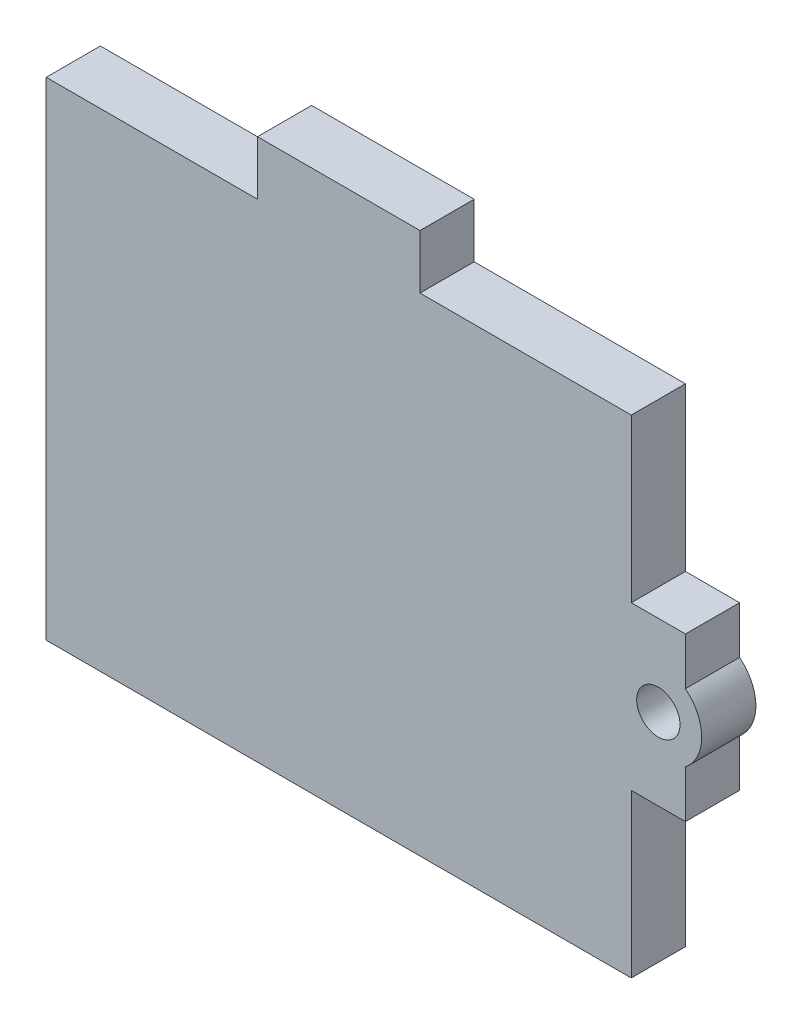
ISO-10303-21;
HEADER;
FILE_DESCRIPTION(('STEP AP214'),'2;1');
FILE_NAME('part.step','',(''),(''),'','','');
FILE_SCHEMA(('AUTOMOTIVE_DESIGN { 1 0 10303 214 1 1 1 1 }'));
ENDSEC;
DATA;
#1=APPLICATION_CONTEXT('core data for automotive mechanical design processes');
#2=APPLICATION_PROTOCOL_DEFINITION('international standard','automotive_design',2000,#1);
#3=PRODUCT_CONTEXT('',#1,'mechanical');
#4=PRODUCT('Part','Part','',(#3));
#5=PRODUCT_RELATED_PRODUCT_CATEGORY('part','',(#4));
#6=PRODUCT_DEFINITION_FORMATION('','',#4);
#7=PRODUCT_DEFINITION_CONTEXT('part definition',#1,'design');
#8=PRODUCT_DEFINITION('design','',#6,#7);
#9=PRODUCT_DEFINITION_SHAPE('','',#8);
#10=(LENGTH_UNIT() NAMED_UNIT(*) SI_UNIT(.MILLI.,.METRE.));
#11=(NAMED_UNIT(*) PLANE_ANGLE_UNIT() SI_UNIT($,.RADIAN.));
#12=(NAMED_UNIT(*) SI_UNIT($,.STERADIAN.) SOLID_ANGLE_UNIT());
#13=UNCERTAINTY_MEASURE_WITH_UNIT(LENGTH_MEASURE(1.E-05),#10,'distance_accuracy_value','');
#14=(GEOMETRIC_REPRESENTATION_CONTEXT(3) GLOBAL_UNCERTAINTY_ASSIGNED_CONTEXT((#13)) GLOBAL_UNIT_ASSIGNED_CONTEXT((#10,
#11,#12)) REPRESENTATION_CONTEXT('',''));
#15=CARTESIAN_POINT('',(0.,0.,0.));
#16=DIRECTION('',(0.,0.,1.));
#17=DIRECTION('',(1.,0.,0.));
#18=AXIS2_PLACEMENT_3D('',#15,#16,#17);
#19=CARTESIAN_POINT('',(32.0000000000081,7.5,0.));
#20=DIRECTION('',(1.,0.,0.));
#21=DIRECTION('',(0.,0.,-1.));
#22=AXIS2_PLACEMENT_3D('',#19,#20,#21);
#23=PLANE('',#22);
#24=DIRECTION('',(0.,0.,1.));
#25=VECTOR('',#24,1.);
#26=CARTESIAN_POINT('',(32.0000000000081,3.1224989991992,0.));
#27=LINE('',#26,#25);
#28=CARTESIAN_POINT('',(32.0000000000081,3.1224989991992,0.));
#29=VERTEX_POINT('',#28);
#30=CARTESIAN_POINT('',(32.0000000000081,3.1224989991992,5.));
#31=VERTEX_POINT('',#30);
#32=EDGE_CURVE('E11',#29,#31,#27,.T.);
#33=ORIENTED_EDGE('',*,*,#32,.F.);
#34=DIRECTION('',(0.,1.,0.));
#35=VECTOR('',#34,1.);
#36=CARTESIAN_POINT('',(32.0000000000081,7.5,0.));
#37=LINE('',#36,#35);
#38=CARTESIAN_POINT('',(32.0000000000081,7.5,0.));
#39=VERTEX_POINT('',#38);
#40=EDGE_CURVE('E247',#29,#39,#37,.T.);
#41=ORIENTED_EDGE('',*,*,#40,.T.);
#42=DIRECTION('',(0.,0.,1.));
#43=VECTOR('',#42,1.);
#44=CARTESIAN_POINT('',(32.0000000000081,7.5,0.));
#45=LINE('',#44,#43);
#46=CARTESIAN_POINT('',(32.0000000000081,7.5,5.));
#47=VERTEX_POINT('',#46);
#48=EDGE_CURVE('E163',#39,#47,#45,.T.);
#49=ORIENTED_EDGE('',*,*,#48,.T.);
#50=DIRECTION('',(0.,1.,0.));
#51=VECTOR('',#50,1.);
#52=CARTESIAN_POINT('',(32.0000000000081,7.5,5.));
#53=LINE('',#52,#51);
#54=EDGE_CURVE('E152',#31,#47,#53,.T.);
#55=ORIENTED_EDGE('',*,*,#54,.F.);
#56=EDGE_LOOP('',(#33,#41,#49,#55));
#57=FACE_BOUND('',#56,.T.);
#58=ADVANCED_FACE('F33',(#57),#23,.T.);
#59=CARTESIAN_POINT('',(-27.,22.5,5.));
#60=DIRECTION('',(0.,-1.,0.));
#61=DIRECTION('',(0.,0.,-1.));
#62=AXIS2_PLACEMENT_3D('',#59,#60,#61);
#63=PLANE('',#62);
#64=DIRECTION('',(0.,0.,1.));
#65=VECTOR('',#64,1.);
#66=CARTESIAN_POINT('',(-7.50000000000001,22.5,0.));
#67=LINE('',#66,#65);
#68=CARTESIAN_POINT('',(-7.50000000000001,22.5,0.));
#69=VERTEX_POINT('',#68);
#70=CARTESIAN_POINT('',(-7.50000000000001,22.5,5.));
#71=VERTEX_POINT('',#70);
#72=EDGE_CURVE('E234',#69,#71,#67,.T.);
#73=ORIENTED_EDGE('',*,*,#72,.F.);
#74=DIRECTION('',(-1.,0.,0.));
#75=VECTOR('',#74,1.);
#76=CARTESIAN_POINT('',(-27.,22.5,0.));
#77=LINE('',#76,#75);
#78=CARTESIAN_POINT('',(-27.,22.5,0.));
#79=VERTEX_POINT('',#78);
#80=EDGE_CURVE('E194',#69,#79,#77,.T.);
#81=ORIENTED_EDGE('',*,*,#80,.T.);
#82=DIRECTION('',(0.,0.,-1.));
#83=VECTOR('',#82,1.);
#84=CARTESIAN_POINT('',(-27.,22.5,5.));
#85=LINE('',#84,#83);
#86=CARTESIAN_POINT('',(-27.,22.5,5.));
#87=VERTEX_POINT('',#86);
#88=EDGE_CURVE('E185',#87,#79,#85,.T.);
#89=ORIENTED_EDGE('',*,*,#88,.F.);
#90=DIRECTION('',(-1.,0.,0.));
#91=VECTOR('',#90,1.);
#92=CARTESIAN_POINT('',(-27.,22.5,5.));
#93=LINE('',#92,#91);
#94=EDGE_CURVE('E181',#71,#87,#93,.T.);
#95=ORIENTED_EDGE('',*,*,#94,.F.);
#96=EDGE_LOOP('',(#73,#81,#89,#95));
#97=FACE_BOUND('',#96,.T.);
#98=ADVANCED_FACE('F233',(#97),#63,.F.);
#99=CARTESIAN_POINT('',(27.,22.5,5.));
#100=DIRECTION('',(-1.,0.,0.));
#101=DIRECTION('',(0.,-1.,0.));
#102=AXIS2_PLACEMENT_3D('',#99,#100,#101);
#103=PLANE('',#102);
#104=DIRECTION('',(0.,0.,1.));
#105=VECTOR('',#104,1.);
#106=CARTESIAN_POINT('',(27.,7.5,0.));
#107=LINE('',#106,#105);
#108=CARTESIAN_POINT('',(27.,7.5,0.));
#109=VERTEX_POINT('',#108);
#110=CARTESIAN_POINT('',(27.,7.5,5.));
#111=VERTEX_POINT('',#110);
#112=EDGE_CURVE('E160',#109,#111,#107,.T.);
#113=ORIENTED_EDGE('',*,*,#112,.F.);
#114=DIRECTION('',(0.,1.,0.));
#115=VECTOR('',#114,1.);
#116=CARTESIAN_POINT('',(27.,22.5,0.));
#117=LINE('',#116,#115);
#118=CARTESIAN_POINT('',(27.,22.5,0.));
#119=VERTEX_POINT('',#118);
#120=EDGE_CURVE('E190',#109,#119,#117,.T.);
#121=ORIENTED_EDGE('',*,*,#120,.T.);
#122=DIRECTION('',(0.,0.,-1.));
#123=VECTOR('',#122,1.);
#124=CARTESIAN_POINT('',(27.,22.5,5.));
#125=LINE('',#124,#123);
#126=CARTESIAN_POINT('',(27.,22.5,5.));
#127=VERTEX_POINT('',#126);
#128=EDGE_CURVE('E199',#127,#119,#125,.T.);
#129=ORIENTED_EDGE('',*,*,#128,.F.);
#130=DIRECTION('',(0.,1.,0.));
#131=VECTOR('',#130,1.);
#132=CARTESIAN_POINT('',(27.,22.5,5.));
#133=LINE('',#132,#131);
#134=EDGE_CURVE('E178',#111,#127,#133,.T.);
#135=ORIENTED_EDGE('',*,*,#134,.F.);
#136=EDGE_LOOP('',(#113,#121,#129,#135));
#137=FACE_BOUND('',#136,.T.);
#138=ADVANCED_FACE('F257',(#137),#103,.F.);
#139=CARTESIAN_POINT('',(-27.,22.5,5.));
#140=DIRECTION('',(1.,0.,0.));
#141=DIRECTION('',(0.,1.,0.));
#142=AXIS2_PLACEMENT_3D('',#139,#140,#141);
#143=PLANE('',#142);
#144=DIRECTION('',(0.,-1.,0.));
#145=VECTOR('',#144,1.);
#146=CARTESIAN_POINT('',(-27.,22.5,0.));
#147=LINE('',#146,#145);
#148=CARTESIAN_POINT('',(-27.,-22.5,0.));
#149=VERTEX_POINT('',#148);
#150=EDGE_CURVE('E162',#79,#149,#147,.T.);
#151=ORIENTED_EDGE('',*,*,#150,.T.);
#152=DIRECTION('',(0.,0.,-1.));
#153=VECTOR('',#152,1.);
#154=CARTESIAN_POINT('',(-27.,-22.5,5.));
#155=LINE('',#154,#153);
#156=CARTESIAN_POINT('',(-27.,-22.5,5.));
#157=VERTEX_POINT('',#156);
#158=EDGE_CURVE('E146',#157,#149,#155,.T.);
#159=ORIENTED_EDGE('',*,*,#158,.F.);
#160=DIRECTION('',(0.,-1.,0.));
#161=VECTOR('',#160,1.);
#162=CARTESIAN_POINT('',(-27.,22.5,5.));
#163=LINE('',#162,#161);
#164=EDGE_CURVE('E172',#87,#157,#163,.T.);
#165=ORIENTED_EDGE('',*,*,#164,.F.);
#166=ORIENTED_EDGE('',*,*,#88,.T.);
#167=EDGE_LOOP('',(#151,#159,#165,#166));
#168=FACE_BOUND('',#167,.T.);
#169=ADVANCED_FACE('F35',(#168),#143,.F.);
#170=CARTESIAN_POINT('',(-27.,-22.5,5.));
#171=DIRECTION('',(0.,1.,0.));
#172=DIRECTION('',(0.,0.,1.));
#173=AXIS2_PLACEMENT_3D('',#170,#171,#172);
#174=PLANE('',#173);
#175=DIRECTION('',(1.,0.,0.));
#176=VECTOR('',#175,1.);
#177=CARTESIAN_POINT('',(-27.,-22.5,0.));
#178=LINE('',#177,#176);
#179=CARTESIAN_POINT('',(27.,-22.5,0.));
#180=VERTEX_POINT('',#179);
#181=EDGE_CURVE('E188',#149,#180,#178,.T.);
#182=ORIENTED_EDGE('',*,*,#181,.T.);
#183=DIRECTION('',(0.,0.,-1.));
#184=VECTOR('',#183,1.);
#185=CARTESIAN_POINT('',(27.,-22.5,5.));
#186=LINE('',#185,#184);
#187=CARTESIAN_POINT('',(27.,-22.5,5.));
#188=VERTEX_POINT('',#187);
#189=EDGE_CURVE('E202',#188,#180,#186,.T.);
#190=ORIENTED_EDGE('',*,*,#189,.F.);
#191=DIRECTION('',(1.,0.,0.));
#192=VECTOR('',#191,1.);
#193=CARTESIAN_POINT('',(-27.,-22.5,5.));
#194=LINE('',#193,#192);
#195=EDGE_CURVE('E175',#157,#188,#194,.T.);
#196=ORIENTED_EDGE('',*,*,#195,.F.);
#197=ORIENTED_EDGE('',*,*,#158,.T.);
#198=EDGE_LOOP('',(#182,#190,#196,#197));
#199=FACE_BOUND('',#198,.T.);
#200=ADVANCED_FACE('F208',(#199),#174,.F.);
#201=CARTESIAN_POINT('',(27.,-7.5,0.));
#202=VERTEX_POINT('',#201);
#203=EDGE_CURVE('E191',#180,#202,#117,.T.);
#204=ORIENTED_EDGE('',*,*,#203,.T.);
#205=DIRECTION('',(0.,0.,1.));
#206=VECTOR('',#205,1.);
#207=CARTESIAN_POINT('',(27.,-7.5,0.));
#208=LINE('',#207,#206);
#209=CARTESIAN_POINT('',(27.,-7.49999999999999,5.));
#210=VERTEX_POINT('',#209);
#211=EDGE_CURVE('E168',#202,#210,#208,.T.);
#212=ORIENTED_EDGE('',*,*,#211,.T.);
#213=EDGE_CURVE('E179',#188,#210,#133,.T.);
#214=ORIENTED_EDGE('',*,*,#213,.F.);
#215=ORIENTED_EDGE('',*,*,#189,.T.);
#216=EDGE_LOOP('',(#204,#212,#214,#215));
#217=FACE_BOUND('',#216,.T.);
#218=ADVANCED_FACE('F224',(#217),#103,.F.);
#219=CARTESIAN_POINT('',(7.49999999999999,22.5,0.));
#220=VERTEX_POINT('',#219);
#221=EDGE_CURVE('E176',#119,#220,#77,.T.);
#222=ORIENTED_EDGE('',*,*,#221,.T.);
#223=DIRECTION('',(0.,0.,1.));
#224=VECTOR('',#223,1.);
#225=CARTESIAN_POINT('',(7.49999999999999,22.5,0.));
#226=LINE('',#225,#224);
#227=CARTESIAN_POINT('',(7.5,22.5,5.));
#228=VERTEX_POINT('',#227);
#229=EDGE_CURVE('E236',#220,#228,#226,.T.);
#230=ORIENTED_EDGE('',*,*,#229,.T.);
#231=EDGE_CURVE('E182',#127,#228,#93,.T.);
#232=ORIENTED_EDGE('',*,*,#231,.F.);
#233=ORIENTED_EDGE('',*,*,#128,.T.);
#234=EDGE_LOOP('',(#222,#230,#232,#233));
#235=FACE_BOUND('',#234,.T.);
#236=ADVANCED_FACE('F264',(#235),#63,.F.);
#237=CARTESIAN_POINT('',(0.,0.,5.));
#238=DIRECTION('',(0.,0.,1.));
#239=DIRECTION('',(1.,0.,0.));
#240=AXIS2_PLACEMENT_3D('',#237,#238,#239);
#241=PLANE('',#240);
#242=CARTESIAN_POINT('',(32.0000000000081,-7.5,5.));
#243=VERTEX_POINT('',#242);
#244=CARTESIAN_POINT('',(32.0000000000081,-3.12249899919921,5.));
#245=VERTEX_POINT('',#244);
#246=EDGE_CURVE('E142',#243,#245,#53,.T.);
#247=ORIENTED_EDGE('',*,*,#246,.T.);
#248=CARTESIAN_POINT('',(29.5000000000081,0.,5.));
#249=DIRECTION('',(0.,0.,1.));
#250=DIRECTION('',(1.,0.,0.));
#251=AXIS2_PLACEMENT_3D('',#248,#249,#250);
#252=CIRCLE('',#251,4.);
#253=EDGE_CURVE('E48',#245,#31,#252,.T.);
#254=ORIENTED_EDGE('',*,*,#253,.T.);
#255=ORIENTED_EDGE('',*,*,#54,.T.);
#256=DIRECTION('',(-1.,0.,0.));
#257=VECTOR('',#256,1.);
#258=CARTESIAN_POINT('',(27.,7.5,5.));
#259=LINE('',#258,#257);
#260=EDGE_CURVE('E151',#47,#111,#259,.T.);
#261=ORIENTED_EDGE('',*,*,#260,.T.);
#262=ORIENTED_EDGE('',*,*,#134,.T.);
#263=ORIENTED_EDGE('',*,*,#231,.T.);
#264=DIRECTION('',(0.,1.,0.));
#265=VECTOR('',#264,1.);
#266=CARTESIAN_POINT('',(7.49999999999999,22.5,5.));
#267=LINE('',#266,#265);
#268=CARTESIAN_POINT('',(7.49999999999999,27.5000000000001,5.));
#269=VERTEX_POINT('',#268);
#270=EDGE_CURVE('E55',#228,#269,#267,.T.);
#271=ORIENTED_EDGE('',*,*,#270,.T.);
#272=DIRECTION('',(-1.,0.,0.));
#273=VECTOR('',#272,1.);
#274=CARTESIAN_POINT('',(-7.50000000000001,27.5000000000001,5.));
#275=LINE('',#274,#273);
#276=CARTESIAN_POINT('',(-7.50000000000001,27.5000000000001,5.));
#277=VERTEX_POINT('',#276);
#278=EDGE_CURVE('E278',#269,#277,#275,.T.);
#279=ORIENTED_EDGE('',*,*,#278,.T.);
#280=DIRECTION('',(0.,-1.,0.));
#281=VECTOR('',#280,1.);
#282=CARTESIAN_POINT('',(-7.50000000000001,22.5,5.));
#283=LINE('',#282,#281);
#284=EDGE_CURVE('E230',#277,#71,#283,.T.);
#285=ORIENTED_EDGE('',*,*,#284,.T.);
#286=ORIENTED_EDGE('',*,*,#94,.T.);
#287=ORIENTED_EDGE('',*,*,#164,.T.);
#288=ORIENTED_EDGE('',*,*,#195,.T.);
#289=ORIENTED_EDGE('',*,*,#213,.T.);
#290=DIRECTION('',(1.,0.,0.));
#291=VECTOR('',#290,1.);
#292=CARTESIAN_POINT('',(27.,-7.5,5.));
#293=LINE('',#292,#291);
#294=EDGE_CURVE('E150',#210,#243,#293,.T.);
#295=ORIENTED_EDGE('',*,*,#294,.T.);
#296=EDGE_LOOP('',(#247,#254,#255,#261,#262,#263,#271,#279,#285,#286,#287,#288,#289,#295));
#297=FACE_BOUND('',#296,.T.);
#298=CARTESIAN_POINT('',(29.5000000000081,0.,5.));
#299=DIRECTION('',(0.,0.,1.));
#300=DIRECTION('',(1.,0.,0.));
#301=AXIS2_PLACEMENT_3D('',#298,#299,#300);
#302=CIRCLE('',#301,2.00000000000001);
#303=CARTESIAN_POINT('',(31.5000000000081,0.,5.));
#304=VERTEX_POINT('',#303);
#305=EDGE_CURVE('E268',#304,#304,#302,.T.);
#306=ORIENTED_EDGE('',*,*,#305,.F.);
#307=EDGE_LOOP('',(#306));
#308=FACE_BOUND('',#307,.T.);
#309=ADVANCED_FACE('F147',(#297,#308),#241,.T.);
#310=CARTESIAN_POINT('',(0.,0.,0.));
#311=DIRECTION('',(0.,0.,1.));
#312=DIRECTION('',(1.,0.,0.));
#313=AXIS2_PLACEMENT_3D('',#310,#311,#312);
#314=PLANE('',#313);
#315=ORIENTED_EDGE('',*,*,#40,.F.);
#316=CARTESIAN_POINT('',(29.5000000000081,0.,0.));
#317=DIRECTION('',(0.,0.,1.));
#318=DIRECTION('',(1.,0.,0.));
#319=AXIS2_PLACEMENT_3D('',#316,#317,#318);
#320=CIRCLE('',#319,4.);
#321=CARTESIAN_POINT('',(32.0000000000081,-3.12249899919921,0.));
#322=VERTEX_POINT('',#321);
#323=EDGE_CURVE('E136',#322,#29,#320,.T.);
#324=ORIENTED_EDGE('',*,*,#323,.F.);
#325=CARTESIAN_POINT('',(32.0000000000081,-7.5,0.));
#326=VERTEX_POINT('',#325);
#327=EDGE_CURVE('E145',#326,#322,#37,.T.);
#328=ORIENTED_EDGE('',*,*,#327,.F.);
#329=DIRECTION('',(1.,0.,0.));
#330=VECTOR('',#329,1.);
#331=CARTESIAN_POINT('',(27.,-7.5,0.));
#332=LINE('',#331,#330);
#333=EDGE_CURVE('E155',#202,#326,#332,.T.);
#334=ORIENTED_EDGE('',*,*,#333,.F.);
#335=ORIENTED_EDGE('',*,*,#203,.F.);
#336=ORIENTED_EDGE('',*,*,#181,.F.);
#337=ORIENTED_EDGE('',*,*,#150,.F.);
#338=ORIENTED_EDGE('',*,*,#80,.F.);
#339=DIRECTION('',(0.,-1.,0.));
#340=VECTOR('',#339,1.);
#341=CARTESIAN_POINT('',(-7.50000000000001,22.5,0.));
#342=LINE('',#341,#340);
#343=CARTESIAN_POINT('',(-7.50000000000001,27.5000000000001,0.));
#344=VERTEX_POINT('',#343);
#345=EDGE_CURVE('E276',#344,#69,#342,.T.);
#346=ORIENTED_EDGE('',*,*,#345,.F.);
#347=DIRECTION('',(-1.,0.,0.));
#348=VECTOR('',#347,1.);
#349=CARTESIAN_POINT('',(-7.50000000000001,27.5000000000001,0.));
#350=LINE('',#349,#348);
#351=CARTESIAN_POINT('',(7.49999999999999,27.5000000000001,0.));
#352=VERTEX_POINT('',#351);
#353=EDGE_CURVE('E237',#352,#344,#350,.T.);
#354=ORIENTED_EDGE('',*,*,#353,.F.);
#355=DIRECTION('',(0.,1.,0.));
#356=VECTOR('',#355,1.);
#357=CARTESIAN_POINT('',(7.49999999999999,22.5,0.));
#358=LINE('',#357,#356);
#359=EDGE_CURVE('E242',#220,#352,#358,.T.);
#360=ORIENTED_EDGE('',*,*,#359,.F.);
#361=ORIENTED_EDGE('',*,*,#221,.F.);
#362=ORIENTED_EDGE('',*,*,#120,.F.);
#363=DIRECTION('',(-1.,0.,0.));
#364=VECTOR('',#363,1.);
#365=CARTESIAN_POINT('',(27.,7.5,0.));
#366=LINE('',#365,#364);
#367=EDGE_CURVE('E171',#39,#109,#366,.T.);
#368=ORIENTED_EDGE('',*,*,#367,.F.);
#369=EDGE_LOOP('',(#315,#324,#328,#334,#335,#336,#337,#338,#346,#354,#360,#361,#362,#368));
#370=FACE_BOUND('',#369,.T.);
#371=CARTESIAN_POINT('',(29.5000000000081,0.,0.));
#372=DIRECTION('',(0.,0.,1.));
#373=DIRECTION('',(1.,0.,0.));
#374=AXIS2_PLACEMENT_3D('',#371,#372,#373);
#375=CIRCLE('',#374,2.00000000000001);
#376=CARTESIAN_POINT('',(31.5000000000081,0.,0.));
#377=VERTEX_POINT('',#376);
#378=EDGE_CURVE('E271',#377,#377,#375,.T.);
#379=ORIENTED_EDGE('',*,*,#378,.T.);
#380=EDGE_LOOP('',(#379));
#381=FACE_BOUND('',#380,.T.);
#382=ADVANCED_FACE('F217',(#370,#381),#314,.F.);
#383=CARTESIAN_POINT('',(27.,7.5,0.));
#384=DIRECTION('',(0.,1.,0.));
#385=DIRECTION('',(-1.,0.,0.));
#386=AXIS2_PLACEMENT_3D('',#383,#384,#385);
#387=PLANE('',#386);
#388=ORIENTED_EDGE('',*,*,#260,.F.);
#389=ORIENTED_EDGE('',*,*,#48,.F.);
#390=ORIENTED_EDGE('',*,*,#367,.T.);
#391=ORIENTED_EDGE('',*,*,#112,.T.);
#392=EDGE_LOOP('',(#388,#389,#390,#391));
#393=FACE_BOUND('',#392,.T.);
#394=ADVANCED_FACE('F253',(#393),#387,.T.);
#395=DIRECTION('',(0.,0.,1.));
#396=VECTOR('',#395,1.);
#397=CARTESIAN_POINT('',(32.0000000000081,-3.12249899919921,0.));
#398=LINE('',#397,#396);
#399=EDGE_CURVE('E41',#245,#322,#398,.F.);
#400=ORIENTED_EDGE('',*,*,#399,.F.);
#401=ORIENTED_EDGE('',*,*,#246,.F.);
#402=DIRECTION('',(0.,0.,1.));
#403=VECTOR('',#402,1.);
#404=CARTESIAN_POINT('',(32.0000000000081,-7.5,0.));
#405=LINE('',#404,#403);
#406=EDGE_CURVE('E166',#326,#243,#405,.T.);
#407=ORIENTED_EDGE('',*,*,#406,.F.);
#408=ORIENTED_EDGE('',*,*,#327,.T.);
#409=EDGE_LOOP('',(#400,#401,#407,#408));
#410=FACE_BOUND('',#409,.T.);
#411=ADVANCED_FACE('F141',(#410),#23,.T.);
#412=CARTESIAN_POINT('',(27.,-7.5,0.));
#413=DIRECTION('',(0.,-1.,0.));
#414=DIRECTION('',(0.,0.,-1.));
#415=AXIS2_PLACEMENT_3D('',#412,#413,#414);
#416=PLANE('',#415);
#417=ORIENTED_EDGE('',*,*,#294,.F.);
#418=ORIENTED_EDGE('',*,*,#211,.F.);
#419=ORIENTED_EDGE('',*,*,#333,.T.);
#420=ORIENTED_EDGE('',*,*,#406,.T.);
#421=EDGE_LOOP('',(#417,#418,#419,#420));
#422=FACE_BOUND('',#421,.T.);
#423=ADVANCED_FACE('F289',(#422),#416,.T.);
#424=CARTESIAN_POINT('',(-7.50000000000001,22.5,0.));
#425=DIRECTION('',(-1.,0.,0.));
#426=DIRECTION('',(0.,-1.,0.));
#427=AXIS2_PLACEMENT_3D('',#424,#425,#426);
#428=PLANE('',#427);
#429=ORIENTED_EDGE('',*,*,#284,.F.);
#430=DIRECTION('',(0.,0.,1.));
#431=VECTOR('',#430,1.);
#432=CARTESIAN_POINT('',(-7.50000000000001,27.5000000000001,0.));
#433=LINE('',#432,#431);
#434=EDGE_CURVE('E283',#344,#277,#433,.T.);
#435=ORIENTED_EDGE('',*,*,#434,.F.);
#436=ORIENTED_EDGE('',*,*,#345,.T.);
#437=ORIENTED_EDGE('',*,*,#72,.T.);
#438=EDGE_LOOP('',(#429,#435,#436,#437));
#439=FACE_BOUND('',#438,.T.);
#440=ADVANCED_FACE('F287',(#439),#428,.T.);
#441=CARTESIAN_POINT('',(-7.50000000000001,27.5000000000001,0.));
#442=DIRECTION('',(0.,1.,0.));
#443=DIRECTION('',(-1.,0.,0.));
#444=AXIS2_PLACEMENT_3D('',#441,#442,#443);
#445=PLANE('',#444);
#446=ORIENTED_EDGE('',*,*,#278,.F.);
#447=DIRECTION('',(0.,0.,1.));
#448=VECTOR('',#447,1.);
#449=CARTESIAN_POINT('',(7.49999999999999,27.5000000000001,0.));
#450=LINE('',#449,#448);
#451=EDGE_CURVE('E239',#352,#269,#450,.T.);
#452=ORIENTED_EDGE('',*,*,#451,.F.);
#453=ORIENTED_EDGE('',*,*,#353,.T.);
#454=ORIENTED_EDGE('',*,*,#434,.T.);
#455=EDGE_LOOP('',(#446,#452,#453,#454));
#456=FACE_BOUND('',#455,.T.);
#457=ADVANCED_FACE('F286',(#456),#445,.T.);
#458=CARTESIAN_POINT('',(7.49999999999999,22.5,0.));
#459=DIRECTION('',(1.,0.,0.));
#460=DIRECTION('',(0.,0.,-1.));
#461=AXIS2_PLACEMENT_3D('',#458,#459,#460);
#462=PLANE('',#461);
#463=ORIENTED_EDGE('',*,*,#270,.F.);
#464=ORIENTED_EDGE('',*,*,#229,.F.);
#465=ORIENTED_EDGE('',*,*,#359,.T.);
#466=ORIENTED_EDGE('',*,*,#451,.T.);
#467=EDGE_LOOP('',(#463,#464,#465,#466));
#468=FACE_BOUND('',#467,.T.);
#469=ADVANCED_FACE('F284',(#468),#462,.T.);
#470=CARTESIAN_POINT('',(29.5000000000081,0.,0.));
#471=DIRECTION('',(0.,0.,1.));
#472=DIRECTION('',(1.,0.,0.));
#473=AXIS2_PLACEMENT_3D('',#470,#471,#472);
#474=CYLINDRICAL_SURFACE('',#473,2.00000000000001);
#475=ORIENTED_EDGE('',*,*,#378,.F.);
#476=EDGE_LOOP('',(#475));
#477=FACE_BOUND('',#476,.T.);
#478=ORIENTED_EDGE('',*,*,#305,.T.);
#479=EDGE_LOOP('',(#478));
#480=FACE_BOUND('',#479,.T.);
#481=ADVANCED_FACE('F395',(#477,#480),#474,.F.);
#482=CARTESIAN_POINT('',(29.5000000000081,0.,0.));
#483=DIRECTION('',(0.,0.,1.));
#484=DIRECTION('',(1.,0.,0.));
#485=AXIS2_PLACEMENT_3D('',#482,#483,#484);
#486=CYLINDRICAL_SURFACE('',#485,4.);
#487=ORIENTED_EDGE('',*,*,#323,.T.);
#488=ORIENTED_EDGE('',*,*,#32,.T.);
#489=ORIENTED_EDGE('',*,*,#253,.F.);
#490=ORIENTED_EDGE('',*,*,#399,.T.);
#491=EDGE_LOOP('',(#487,#488,#489,#490));
#492=FACE_BOUND('',#491,.T.);
#493=ADVANCED_FACE('F132',(#492),#486,.T.);
#494=CLOSED_SHELL('',(#58,#98,#138,#169,#200,#218,#236,#309,#382,#394,#411,#423,#440,#457,#469,
#481,#493));
#495=MANIFOLD_SOLID_BREP('B2',#494);
#496=ADVANCED_BREP_SHAPE_REPRESENTATION('',(#18,#495),#14);
#497=SHAPE_DEFINITION_REPRESENTATION(#9,#496);
ENDSEC;
END-ISO-10303-21;
